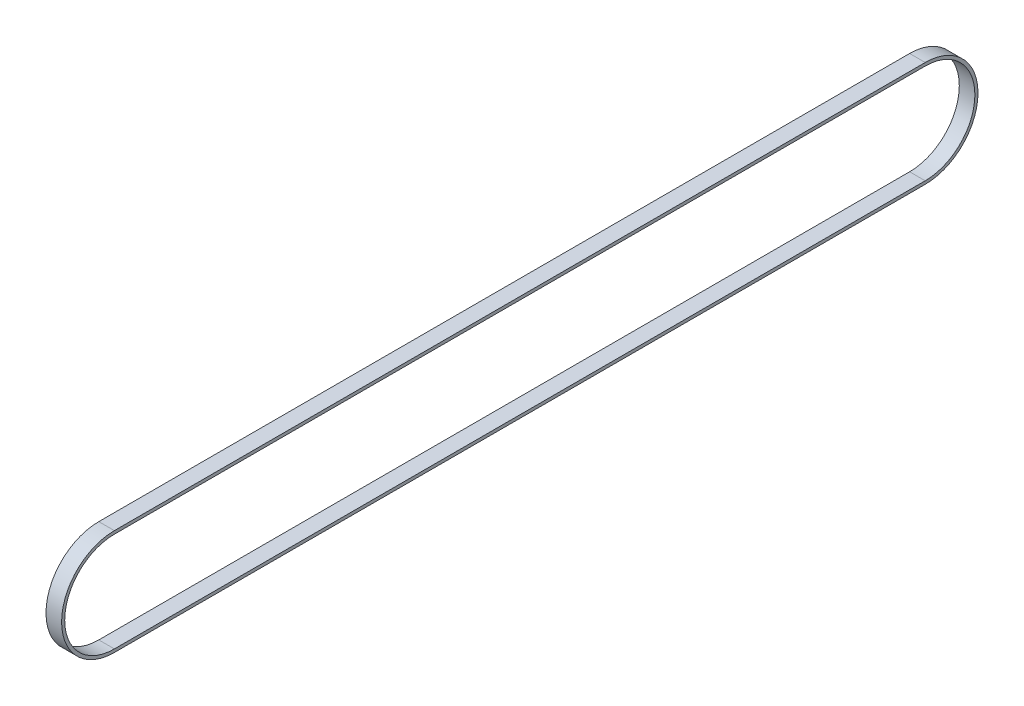
ISO-10303-21;
HEADER;
FILE_DESCRIPTION(('STEP AP214'),'2;1');
FILE_NAME('part.step','',(''),(''),'','','');
FILE_SCHEMA(('AUTOMOTIVE_DESIGN { 1 0 10303 214 1 1 1 1 }'));
ENDSEC;
DATA;
#1=APPLICATION_CONTEXT('core data for automotive mechanical design processes');
#2=APPLICATION_PROTOCOL_DEFINITION('international standard','automotive_design',2000,#1);
#3=PRODUCT_CONTEXT('',#1,'mechanical');
#4=PRODUCT('Part','Part','',(#3));
#5=PRODUCT_RELATED_PRODUCT_CATEGORY('part','',(#4));
#6=PRODUCT_DEFINITION_FORMATION('','',#4);
#7=PRODUCT_DEFINITION_CONTEXT('part definition',#1,'design');
#8=PRODUCT_DEFINITION('design','',#6,#7);
#9=PRODUCT_DEFINITION_SHAPE('','',#8);
#10=(LENGTH_UNIT() NAMED_UNIT(*) SI_UNIT(.MILLI.,.METRE.));
#11=(NAMED_UNIT(*) PLANE_ANGLE_UNIT() SI_UNIT($,.RADIAN.));
#12=(NAMED_UNIT(*) SI_UNIT($,.STERADIAN.) SOLID_ANGLE_UNIT());
#13=UNCERTAINTY_MEASURE_WITH_UNIT(LENGTH_MEASURE(1.E-05),#10,'distance_accuracy_value','');
#14=(GEOMETRIC_REPRESENTATION_CONTEXT(3) GLOBAL_UNCERTAINTY_ASSIGNED_CONTEXT((#13)) GLOBAL_UNIT_ASSIGNED_CONTEXT((#10,
#11,#12)) REPRESENTATION_CONTEXT('',''));
#15=CARTESIAN_POINT('',(0.,0.,0.));
#16=DIRECTION('',(0.,0.,1.));
#17=DIRECTION('',(1.,0.,0.));
#18=AXIS2_PLACEMENT_3D('',#15,#16,#17);
#19=CARTESIAN_POINT('',(10.,0.,0.));
#20=DIRECTION('',(1.,0.,0.));
#21=DIRECTION('',(0.,0.,-1.));
#22=AXIS2_PLACEMENT_3D('',#19,#20,#21);
#23=PLANE('',#22);
#24=CARTESIAN_POINT('',(10.,0.,0.));
#25=DIRECTION('',(1.,0.,0.));
#26=DIRECTION('',(0.,0.,-1.));
#27=AXIS2_PLACEMENT_3D('',#24,#25,#26);
#28=CIRCLE('',#27,33.85);
#29=CARTESIAN_POINT('',(10.,33.85,0.));
#30=VERTEX_POINT('',#29);
#31=CARTESIAN_POINT('',(10.,-33.85,0.));
#32=VERTEX_POINT('',#31);
#33=EDGE_CURVE('E136',#30,#32,#28,.T.);
#34=ORIENTED_EDGE('',*,*,#33,.T.);
#35=DIRECTION('',(0.,0.,-1.));
#36=VECTOR('',#35,1.);
#37=CARTESIAN_POINT('',(10.,-33.85,0.));
#38=LINE('',#37,#36);
#39=CARTESIAN_POINT('',(10.,-33.85,-520.));
#40=VERTEX_POINT('',#39);
#41=EDGE_CURVE('E139',#32,#40,#38,.T.);
#42=ORIENTED_EDGE('',*,*,#41,.T.);
#43=CARTESIAN_POINT('',(10.,0.,-520.));
#44=DIRECTION('',(1.,0.,0.));
#45=DIRECTION('',(0.,0.,1.));
#46=AXIS2_PLACEMENT_3D('',#43,#44,#45);
#47=CIRCLE('',#46,33.85);
#48=CARTESIAN_POINT('',(10.,33.85,-520.));
#49=VERTEX_POINT('',#48);
#50=EDGE_CURVE('E142',#40,#49,#47,.T.);
#51=ORIENTED_EDGE('',*,*,#50,.T.);
#52=DIRECTION('',(0.,0.,1.));
#53=VECTOR('',#52,1.);
#54=CARTESIAN_POINT('',(10.,33.85,-520.));
#55=LINE('',#54,#53);
#56=EDGE_CURVE('E144',#49,#30,#55,.T.);
#57=ORIENTED_EDGE('',*,*,#56,.T.);
#58=EDGE_LOOP('',(#34,#42,#51,#57));
#59=FACE_BOUND('',#58,.T.);
#60=DIRECTION('',(0.,0.,1.));
#61=VECTOR('',#60,1.);
#62=CARTESIAN_POINT('',(10.,31.8500000000001,-520.));
#63=LINE('',#62,#61);
#64=CARTESIAN_POINT('',(10.,31.8500000000001,-520.));
#65=VERTEX_POINT('',#64);
#66=CARTESIAN_POINT('',(10.,31.85,0.));
#67=VERTEX_POINT('',#66);
#68=EDGE_CURVE('E108',#65,#67,#63,.T.);
#69=ORIENTED_EDGE('',*,*,#68,.F.);
#70=CARTESIAN_POINT('',(10.,0.,-520.));
#71=DIRECTION('',(1.,0.,0.));
#72=DIRECTION('',(0.,0.,1.));
#73=AXIS2_PLACEMENT_3D('',#70,#71,#72);
#74=CIRCLE('',#73,31.85);
#75=CARTESIAN_POINT('',(10.,-31.85,-520.));
#76=VERTEX_POINT('',#75);
#77=EDGE_CURVE('E100',#76,#65,#74,.T.);
#78=ORIENTED_EDGE('',*,*,#77,.F.);
#79=DIRECTION('',(0.,0.,-1.));
#80=VECTOR('',#79,1.);
#81=CARTESIAN_POINT('',(10.,-31.85,0.));
#82=LINE('',#81,#80);
#83=CARTESIAN_POINT('',(10.,-31.85,0.));
#84=VERTEX_POINT('',#83);
#85=EDGE_CURVE('E122',#84,#76,#82,.T.);
#86=ORIENTED_EDGE('',*,*,#85,.F.);
#87=CARTESIAN_POINT('',(10.,0.,0.));
#88=DIRECTION('',(1.,0.,0.));
#89=DIRECTION('',(0.,0.,-1.));
#90=AXIS2_PLACEMENT_3D('',#87,#88,#89);
#91=CIRCLE('',#90,31.85);
#92=EDGE_CURVE('E120',#67,#84,#91,.T.);
#93=ORIENTED_EDGE('',*,*,#92,.F.);
#94=EDGE_LOOP('',(#69,#78,#86,#93));
#95=FACE_BOUND('',#94,.T.);
#96=ADVANCED_FACE('F35',(#59,#95),#23,.T.);
#97=CARTESIAN_POINT('',(0.,0.,0.));
#98=DIRECTION('',(1.,0.,0.));
#99=DIRECTION('',(0.,0.,-1.));
#100=AXIS2_PLACEMENT_3D('',#97,#98,#99);
#101=PLANE('',#100);
#102=CARTESIAN_POINT('',(0.,0.,0.));
#103=DIRECTION('',(1.,0.,0.));
#104=DIRECTION('',(0.,0.,-1.));
#105=AXIS2_PLACEMENT_3D('',#102,#103,#104);
#106=CIRCLE('',#105,33.85);
#107=CARTESIAN_POINT('',(0.,33.85,0.));
#108=VERTEX_POINT('',#107);
#109=CARTESIAN_POINT('',(0.,-33.85,0.));
#110=VERTEX_POINT('',#109);
#111=EDGE_CURVE('E116',#108,#110,#106,.T.);
#112=ORIENTED_EDGE('',*,*,#111,.F.);
#113=DIRECTION('',(0.,0.,1.));
#114=VECTOR('',#113,1.);
#115=CARTESIAN_POINT('',(0.,33.85,-520.));
#116=LINE('',#115,#114);
#117=CARTESIAN_POINT('',(0.,33.85,-520.));
#118=VERTEX_POINT('',#117);
#119=EDGE_CURVE('E140',#118,#108,#116,.T.);
#120=ORIENTED_EDGE('',*,*,#119,.F.);
#121=CARTESIAN_POINT('',(0.,0.,-520.));
#122=DIRECTION('',(1.,0.,0.));
#123=DIRECTION('',(0.,0.,1.));
#124=AXIS2_PLACEMENT_3D('',#121,#122,#123);
#125=CIRCLE('',#124,33.85);
#126=CARTESIAN_POINT('',(0.,-33.85,-520.));
#127=VERTEX_POINT('',#126);
#128=EDGE_CURVE('E151',#127,#118,#125,.T.);
#129=ORIENTED_EDGE('',*,*,#128,.F.);
#130=DIRECTION('',(0.,0.,-1.));
#131=VECTOR('',#130,1.);
#132=CARTESIAN_POINT('',(0.,-33.85,0.));
#133=LINE('',#132,#131);
#134=EDGE_CURVE('E149',#110,#127,#133,.T.);
#135=ORIENTED_EDGE('',*,*,#134,.F.);
#136=EDGE_LOOP('',(#112,#120,#129,#135));
#137=FACE_BOUND('',#136,.T.);
#138=CARTESIAN_POINT('',(0.,0.,-520.));
#139=DIRECTION('',(1.,0.,0.));
#140=DIRECTION('',(0.,0.,1.));
#141=AXIS2_PLACEMENT_3D('',#138,#139,#140);
#142=CIRCLE('',#141,31.85);
#143=CARTESIAN_POINT('',(0.,-31.85,-520.));
#144=VERTEX_POINT('',#143);
#145=CARTESIAN_POINT('',(0.,31.8500000000001,-520.));
#146=VERTEX_POINT('',#145);
#147=EDGE_CURVE('E58',#144,#146,#142,.T.);
#148=ORIENTED_EDGE('',*,*,#147,.T.);
#149=DIRECTION('',(0.,0.,1.));
#150=VECTOR('',#149,1.);
#151=CARTESIAN_POINT('',(0.,31.8500000000001,-520.));
#152=LINE('',#151,#150);
#153=CARTESIAN_POINT('',(0.,31.85,0.));
#154=VERTEX_POINT('',#153);
#155=EDGE_CURVE('E115',#146,#154,#152,.T.);
#156=ORIENTED_EDGE('',*,*,#155,.T.);
#157=CARTESIAN_POINT('',(0.,0.,0.));
#158=DIRECTION('',(1.,0.,0.));
#159=DIRECTION('',(0.,0.,-1.));
#160=AXIS2_PLACEMENT_3D('',#157,#158,#159);
#161=CIRCLE('',#160,31.85);
#162=CARTESIAN_POINT('',(0.,-31.85,0.));
#163=VERTEX_POINT('',#162);
#164=EDGE_CURVE('E128',#154,#163,#161,.T.);
#165=ORIENTED_EDGE('',*,*,#164,.T.);
#166=DIRECTION('',(0.,0.,-1.));
#167=VECTOR('',#166,1.);
#168=CARTESIAN_POINT('',(0.,-31.85,0.));
#169=LINE('',#168,#167);
#170=EDGE_CURVE('E109',#163,#144,#169,.T.);
#171=ORIENTED_EDGE('',*,*,#170,.T.);
#172=EDGE_LOOP('',(#148,#156,#165,#171));
#173=FACE_BOUND('',#172,.T.);
#174=ADVANCED_FACE('F169',(#137,#173),#101,.F.);
#175=CARTESIAN_POINT('',(10.,0.,0.));
#176=DIRECTION('',(-1.,0.,0.));
#177=DIRECTION('',(0.,0.,1.));
#178=AXIS2_PLACEMENT_3D('',#175,#176,#177);
#179=CYLINDRICAL_SURFACE('',#178,33.85);
#180=ORIENTED_EDGE('',*,*,#111,.T.);
#181=DIRECTION('',(-1.,0.,0.));
#182=VECTOR('',#181,1.);
#183=CARTESIAN_POINT('',(10.,-33.85,0.));
#184=LINE('',#183,#182);
#185=EDGE_CURVE('E11',#32,#110,#184,.T.);
#186=ORIENTED_EDGE('',*,*,#185,.F.);
#187=ORIENTED_EDGE('',*,*,#33,.F.);
#188=DIRECTION('',(-1.,0.,0.));
#189=VECTOR('',#188,1.);
#190=CARTESIAN_POINT('',(10.,33.85,0.));
#191=LINE('',#190,#189);
#192=EDGE_CURVE('E146',#30,#108,#191,.T.);
#193=ORIENTED_EDGE('',*,*,#192,.T.);
#194=EDGE_LOOP('',(#180,#186,#187,#193));
#195=FACE_BOUND('',#194,.T.);
#196=ADVANCED_FACE('F37',(#195),#179,.T.);
#197=CARTESIAN_POINT('',(10.,-33.85,0.));
#198=DIRECTION('',(0.,1.,0.));
#199=DIRECTION('',(0.,0.,1.));
#200=AXIS2_PLACEMENT_3D('',#197,#198,#199);
#201=PLANE('',#200);
#202=ORIENTED_EDGE('',*,*,#134,.T.);
#203=DIRECTION('',(-1.,0.,0.));
#204=VECTOR('',#203,1.);
#205=CARTESIAN_POINT('',(10.,-33.85,-520.));
#206=LINE('',#205,#204);
#207=EDGE_CURVE('E43',#40,#127,#206,.T.);
#208=ORIENTED_EDGE('',*,*,#207,.F.);
#209=ORIENTED_EDGE('',*,*,#41,.F.);
#210=ORIENTED_EDGE('',*,*,#185,.T.);
#211=EDGE_LOOP('',(#202,#208,#209,#210));
#212=FACE_BOUND('',#211,.T.);
#213=ADVANCED_FACE('F179',(#212),#201,.F.);
#214=CARTESIAN_POINT('',(10.,0.,-520.));
#215=DIRECTION('',(-1.,0.,0.));
#216=DIRECTION('',(0.,0.,1.));
#217=AXIS2_PLACEMENT_3D('',#214,#215,#216);
#218=CYLINDRICAL_SURFACE('',#217,33.85);
#219=ORIENTED_EDGE('',*,*,#128,.T.);
#220=DIRECTION('',(-1.,0.,0.));
#221=VECTOR('',#220,1.);
#222=CARTESIAN_POINT('',(10.,33.85,-520.));
#223=LINE('',#222,#221);
#224=EDGE_CURVE('E156',#49,#118,#223,.T.);
#225=ORIENTED_EDGE('',*,*,#224,.F.);
#226=ORIENTED_EDGE('',*,*,#50,.F.);
#227=ORIENTED_EDGE('',*,*,#207,.T.);
#228=EDGE_LOOP('',(#219,#225,#226,#227));
#229=FACE_BOUND('',#228,.T.);
#230=ADVANCED_FACE('F163',(#229),#218,.T.);
#231=CARTESIAN_POINT('',(10.,33.85,-520.));
#232=DIRECTION('',(0.,-1.,0.));
#233=DIRECTION('',(0.,0.,-1.));
#234=AXIS2_PLACEMENT_3D('',#231,#232,#233);
#235=PLANE('',#234);
#236=ORIENTED_EDGE('',*,*,#119,.T.);
#237=ORIENTED_EDGE('',*,*,#192,.F.);
#238=ORIENTED_EDGE('',*,*,#56,.F.);
#239=ORIENTED_EDGE('',*,*,#224,.T.);
#240=EDGE_LOOP('',(#236,#237,#238,#239));
#241=FACE_BOUND('',#240,.T.);
#242=ADVANCED_FACE('F173',(#241),#235,.F.);
#243=CARTESIAN_POINT('',(10.,0.,-520.));
#244=DIRECTION('',(-1.,0.,0.));
#245=DIRECTION('',(0.,0.,1.));
#246=AXIS2_PLACEMENT_3D('',#243,#244,#245);
#247=CYLINDRICAL_SURFACE('',#246,31.85);
#248=ORIENTED_EDGE('',*,*,#147,.F.);
#249=DIRECTION('',(-1.,0.,0.));
#250=VECTOR('',#249,1.);
#251=CARTESIAN_POINT('',(10.,-31.85,-520.));
#252=LINE('',#251,#250);
#253=EDGE_CURVE('E104',#76,#144,#252,.T.);
#254=ORIENTED_EDGE('',*,*,#253,.F.);
#255=ORIENTED_EDGE('',*,*,#77,.T.);
#256=DIRECTION('',(-1.,0.,0.));
#257=VECTOR('',#256,1.);
#258=CARTESIAN_POINT('',(10.,31.8500000000001,-520.));
#259=LINE('',#258,#257);
#260=EDGE_CURVE('E103',#65,#146,#259,.T.);
#261=ORIENTED_EDGE('',*,*,#260,.T.);
#262=EDGE_LOOP('',(#248,#254,#255,#261));
#263=FACE_BOUND('',#262,.T.);
#264=ADVANCED_FACE('F102',(#263),#247,.F.);
#265=CARTESIAN_POINT('',(10.,31.8500000000001,-520.));
#266=DIRECTION('',(0.,-1.,0.));
#267=DIRECTION('',(0.,0.,-1.));
#268=AXIS2_PLACEMENT_3D('',#265,#266,#267);
#269=PLANE('',#268);
#270=ORIENTED_EDGE('',*,*,#155,.F.);
#271=ORIENTED_EDGE('',*,*,#260,.F.);
#272=ORIENTED_EDGE('',*,*,#68,.T.);
#273=DIRECTION('',(-1.,0.,0.));
#274=VECTOR('',#273,1.);
#275=CARTESIAN_POINT('',(10.,31.85,0.));
#276=LINE('',#275,#274);
#277=EDGE_CURVE('E117',#67,#154,#276,.T.);
#278=ORIENTED_EDGE('',*,*,#277,.T.);
#279=EDGE_LOOP('',(#270,#271,#272,#278));
#280=FACE_BOUND('',#279,.T.);
#281=ADVANCED_FACE('F112',(#280),#269,.T.);
#282=CARTESIAN_POINT('',(10.,0.,0.));
#283=DIRECTION('',(-1.,0.,0.));
#284=DIRECTION('',(0.,0.,1.));
#285=AXIS2_PLACEMENT_3D('',#282,#283,#284);
#286=CYLINDRICAL_SURFACE('',#285,31.85);
#287=ORIENTED_EDGE('',*,*,#164,.F.);
#288=ORIENTED_EDGE('',*,*,#277,.F.);
#289=ORIENTED_EDGE('',*,*,#92,.T.);
#290=DIRECTION('',(-1.,0.,0.));
#291=VECTOR('',#290,1.);
#292=CARTESIAN_POINT('',(10.,-31.85,0.));
#293=LINE('',#292,#291);
#294=EDGE_CURVE('E50',#84,#163,#293,.T.);
#295=ORIENTED_EDGE('',*,*,#294,.T.);
#296=EDGE_LOOP('',(#287,#288,#289,#295));
#297=FACE_BOUND('',#296,.T.);
#298=ADVANCED_FACE('F202',(#297),#286,.F.);
#299=CARTESIAN_POINT('',(10.,-31.85,0.));
#300=DIRECTION('',(0.,1.,0.));
#301=DIRECTION('',(0.,0.,1.));
#302=AXIS2_PLACEMENT_3D('',#299,#300,#301);
#303=PLANE('',#302);
#304=ORIENTED_EDGE('',*,*,#170,.F.);
#305=ORIENTED_EDGE('',*,*,#294,.F.);
#306=ORIENTED_EDGE('',*,*,#85,.T.);
#307=ORIENTED_EDGE('',*,*,#253,.T.);
#308=EDGE_LOOP('',(#304,#305,#306,#307));
#309=FACE_BOUND('',#308,.T.);
#310=ADVANCED_FACE('F206',(#309),#303,.T.);
#311=CLOSED_SHELL('',(#96,#174,#196,#213,#230,#242,#264,#281,#298,#310));
#312=MANIFOLD_SOLID_BREP('B2',#311);
#313=ADVANCED_BREP_SHAPE_REPRESENTATION('',(#18,#312),#14);
#314=SHAPE_DEFINITION_REPRESENTATION(#9,#313);
ENDSEC;
END-ISO-10303-21;
